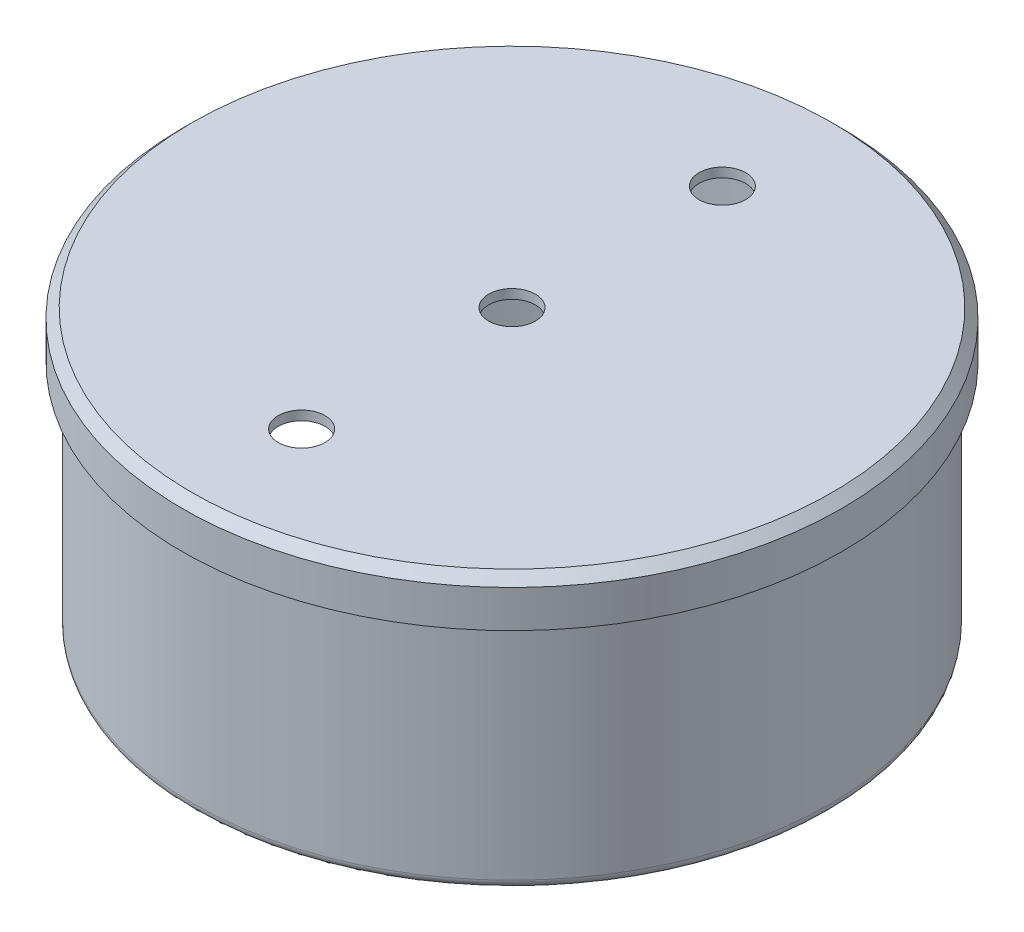
ISO-10303-21;
HEADER;
FILE_DESCRIPTION(('STEP AP214'),'2;1');
FILE_NAME('part.step','',(''),(''),'','','');
FILE_SCHEMA(('AUTOMOTIVE_DESIGN { 1 0 10303 214 1 1 1 1 }'));
ENDSEC;
DATA;
#1=APPLICATION_CONTEXT('core data for automotive mechanical design processes');
#2=APPLICATION_PROTOCOL_DEFINITION('international standard','automotive_design',2000,#1);
#3=PRODUCT_CONTEXT('',#1,'mechanical');
#4=PRODUCT('Part','Part','',(#3));
#5=PRODUCT_RELATED_PRODUCT_CATEGORY('part','',(#4));
#6=PRODUCT_DEFINITION_FORMATION('','',#4);
#7=PRODUCT_DEFINITION_CONTEXT('part definition',#1,'design');
#8=PRODUCT_DEFINITION('design','',#6,#7);
#9=PRODUCT_DEFINITION_SHAPE('','',#8);
#10=(LENGTH_UNIT() NAMED_UNIT(*) SI_UNIT(.MILLI.,.METRE.));
#11=(NAMED_UNIT(*) PLANE_ANGLE_UNIT() SI_UNIT($,.RADIAN.));
#12=(NAMED_UNIT(*) SI_UNIT($,.STERADIAN.) SOLID_ANGLE_UNIT());
#13=UNCERTAINTY_MEASURE_WITH_UNIT(LENGTH_MEASURE(1.E-05),#10,'distance_accuracy_value','');
#14=(GEOMETRIC_REPRESENTATION_CONTEXT(3) GLOBAL_UNCERTAINTY_ASSIGNED_CONTEXT((#13)) GLOBAL_UNIT_ASSIGNED_CONTEXT((#10,
#11,#12)) REPRESENTATION_CONTEXT('',''));
#15=CARTESIAN_POINT('',(0.,0.,0.));
#16=DIRECTION('',(0.,0.,1.));
#17=DIRECTION('',(1.,0.,0.));
#18=AXIS2_PLACEMENT_3D('',#15,#16,#17);
#19=CARTESIAN_POINT('',(0.,-58.,0.));
#20=DIRECTION('',(0.,-1.,0.));
#21=DIRECTION('',(1.,0.,0.));
#22=AXIS2_PLACEMENT_3D('',#19,#20,#21);
#23=TOROIDAL_SURFACE('',#22,66.,1.99999999999999);
#24=CARTESIAN_POINT('',(0.,-58.,0.));
#25=DIRECTION('',(0.,-1.,0.));
#26=DIRECTION('',(1.,0.,0.));
#27=AXIS2_PLACEMENT_3D('',#24,#25,#26);
#28=CIRCLE('',#27,68.);
#29=CARTESIAN_POINT('',(68.,-58.,0.));
#30=VERTEX_POINT('',#29);
#31=EDGE_CURVE('E88',#30,#30,#28,.T.);
#32=ORIENTED_EDGE('',*,*,#31,.T.);
#33=EDGE_LOOP('',(#32));
#34=FACE_BOUND('',#33,.T.);
#35=CARTESIAN_POINT('',(0.,-60.,0.));
#36=DIRECTION('',(0.,-1.,0.));
#37=DIRECTION('',(1.,0.,0.));
#38=AXIS2_PLACEMENT_3D('',#35,#36,#37);
#39=CIRCLE('',#38,66.);
#40=CARTESIAN_POINT('',(66.,-60.,0.));
#41=VERTEX_POINT('',#40);
#42=EDGE_CURVE('E80',#41,#41,#39,.T.);
#43=ORIENTED_EDGE('',*,*,#42,.F.);
#44=EDGE_LOOP('',(#43));
#45=FACE_BOUND('',#44,.T.);
#46=ADVANCED_FACE('F39',(#34,#45),#23,.T.);
#47=CARTESIAN_POINT('',(0.,0.,0.));
#48=DIRECTION('',(0.,1.,0.));
#49=DIRECTION('',(-1.,0.,0.));
#50=AXIS2_PLACEMENT_3D('',#47,#48,#49);
#51=PLANE('',#50);
#52=CARTESIAN_POINT('',(0.,0.,-45.));
#53=DIRECTION('',(0.,1.,0.));
#54=DIRECTION('',(0.,0.,1.));
#55=AXIS2_PLACEMENT_3D('',#52,#53,#54);
#56=CIRCLE('',#55,5.);
#57=CARTESIAN_POINT('',(0.,0.,-40.));
#58=VERTEX_POINT('',#57);
#59=EDGE_CURVE('E63',#58,#58,#56,.T.);
#60=ORIENTED_EDGE('',*,*,#59,.F.);
#61=EDGE_LOOP('',(#60));
#62=FACE_BOUND('',#61,.T.);
#63=CARTESIAN_POINT('',(0.,0.,45.));
#64=DIRECTION('',(0.,1.,0.));
#65=DIRECTION('',(0.,0.,1.));
#66=AXIS2_PLACEMENT_3D('',#63,#64,#65);
#67=CIRCLE('',#66,5.);
#68=CARTESIAN_POINT('',(0.,0.,50.));
#69=VERTEX_POINT('',#68);
#70=EDGE_CURVE('E68',#69,#69,#67,.T.);
#71=ORIENTED_EDGE('',*,*,#70,.F.);
#72=EDGE_LOOP('',(#71));
#73=FACE_BOUND('',#72,.T.);
#74=CARTESIAN_POINT('',(0.,0.,0.));
#75=DIRECTION('',(0.,1.,0.));
#76=DIRECTION('',(0.,0.,1.));
#77=AXIS2_PLACEMENT_3D('',#74,#75,#76);
#78=CIRCLE('',#77,5.);
#79=CARTESIAN_POINT('',(0.,0.,5.));
#80=VERTEX_POINT('',#79);
#81=EDGE_CURVE('E60',#80,#80,#78,.T.);
#82=ORIENTED_EDGE('',*,*,#81,.F.);
#83=EDGE_LOOP('',(#82));
#84=FACE_BOUND('',#83,.T.);
#85=CARTESIAN_POINT('',(0.,0.,0.));
#86=DIRECTION('',(0.,1.,0.));
#87=DIRECTION('',(-1.,0.,0.));
#88=AXIS2_PLACEMENT_3D('',#85,#86,#87);
#89=CIRCLE('',#88,68.4999998132484);
#90=CARTESIAN_POINT('',(-68.4999998132484,0.,0.));
#91=VERTEX_POINT('',#90);
#92=EDGE_CURVE('E10',#91,#91,#89,.T.);
#93=ORIENTED_EDGE('',*,*,#92,.T.);
#94=EDGE_LOOP('',(#93));
#95=FACE_BOUND('',#94,.T.);
#96=ADVANCED_FACE('F101',(#62,#73,#84,#95),#51,.T.);
#97=CARTESIAN_POINT('',(0.,-60.,0.));
#98=DIRECTION('',(0.,-1.,0.));
#99=DIRECTION('',(1.,0.,0.));
#100=AXIS2_PLACEMENT_3D('',#97,#98,#99);
#101=CYLINDRICAL_SURFACE('',#100,70.4999998132484);
#102=CARTESIAN_POINT('',(0.,-2.00000000000004,0.));
#103=DIRECTION('',(0.,1.,0.));
#104=DIRECTION('',(-1.,0.,0.));
#105=AXIS2_PLACEMENT_3D('',#102,#103,#104);
#106=CIRCLE('',#105,70.4999998132484);
#107=CARTESIAN_POINT('',(-70.4999998132484,-2.00000000000006,0.));
#108=VERTEX_POINT('',#107);
#109=EDGE_CURVE('E48',#108,#108,#106,.F.);
#110=ORIENTED_EDGE('',*,*,#109,.T.);
#111=EDGE_LOOP('',(#110));
#112=FACE_BOUND('',#111,.T.);
#113=CARTESIAN_POINT('',(0.,-10.,0.));
#114=DIRECTION('',(0.,-1.,0.));
#115=DIRECTION('',(1.,0.,0.));
#116=AXIS2_PLACEMENT_3D('',#113,#114,#115);
#117=CIRCLE('',#116,70.4999998132484);
#118=CARTESIAN_POINT('',(70.4999998132484,-9.99999999999999,0.));
#119=VERTEX_POINT('',#118);
#120=EDGE_CURVE('E53',#119,#119,#117,.T.);
#121=ORIENTED_EDGE('',*,*,#120,.F.);
#122=EDGE_LOOP('',(#121));
#123=FACE_BOUND('',#122,.T.);
#124=ADVANCED_FACE('F99',(#112,#123),#101,.T.);
#125=CARTESIAN_POINT('',(70.4999998132484,-9.99999999999999,0.));
#126=DIRECTION('',(0.,-1.,0.));
#127=DIRECTION('',(1.,0.,0.));
#128=AXIS2_PLACEMENT_3D('',#125,#126,#127);
#129=PLANE('',#128);
#130=ORIENTED_EDGE('',*,*,#120,.T.);
#131=EDGE_LOOP('',(#130));
#132=FACE_BOUND('',#131,.T.);
#133=CARTESIAN_POINT('',(0.,-10.,0.));
#134=DIRECTION('',(0.,-1.,0.));
#135=DIRECTION('',(1.,0.,0.));
#136=AXIS2_PLACEMENT_3D('',#133,#134,#135);
#137=CIRCLE('',#136,68.);
#138=CARTESIAN_POINT('',(68.,-9.99999999999999,0.));
#139=VERTEX_POINT('',#138);
#140=EDGE_CURVE('E91',#139,#139,#137,.T.);
#141=ORIENTED_EDGE('',*,*,#140,.F.);
#142=EDGE_LOOP('',(#141));
#143=FACE_BOUND('',#142,.T.);
#144=ADVANCED_FACE('F96',(#132,#143),#129,.T.);
#145=CARTESIAN_POINT('',(0.,-60.,0.));
#146=DIRECTION('',(0.,-1.,0.));
#147=DIRECTION('',(1.,0.,0.));
#148=AXIS2_PLACEMENT_3D('',#145,#146,#147);
#149=CYLINDRICAL_SURFACE('',#148,68.);
#150=ORIENTED_EDGE('',*,*,#140,.T.);
#151=EDGE_LOOP('',(#150));
#152=FACE_BOUND('',#151,.T.);
#153=ORIENTED_EDGE('',*,*,#31,.F.);
#154=EDGE_LOOP('',(#153));
#155=FACE_BOUND('',#154,.T.);
#156=ADVANCED_FACE('F108',(#152,#155),#149,.T.);
#157=CARTESIAN_POINT('',(0.,-2.00000000000001,0.));
#158=DIRECTION('',(0.,1.,0.));
#159=DIRECTION('',(-1.,0.,0.));
#160=AXIS2_PLACEMENT_3D('',#157,#158,#159);
#161=PLANE('',#160);
#162=CARTESIAN_POINT('',(0.,-2.00000000000001,-45.));
#163=DIRECTION('',(0.,1.,0.));
#164=DIRECTION('',(-1.,0.,0.));
#165=AXIS2_PLACEMENT_3D('',#162,#163,#164);
#166=CIRCLE('',#165,5.);
#167=CARTESIAN_POINT('',(-5.,-2.00000000000001,-45.));
#168=VERTEX_POINT('',#167);
#169=EDGE_CURVE('E44',#168,#168,#166,.T.);
#170=ORIENTED_EDGE('',*,*,#169,.T.);
#171=EDGE_LOOP('',(#170));
#172=FACE_BOUND('',#171,.T.);
#173=CARTESIAN_POINT('',(0.,-2.00000000000001,45.));
#174=DIRECTION('',(0.,1.,0.));
#175=DIRECTION('',(-1.,0.,0.));
#176=AXIS2_PLACEMENT_3D('',#173,#174,#175);
#177=CIRCLE('',#176,5.);
#178=CARTESIAN_POINT('',(-5.,-2.00000000000001,45.));
#179=VERTEX_POINT('',#178);
#180=EDGE_CURVE('E61',#179,#179,#177,.T.);
#181=ORIENTED_EDGE('',*,*,#180,.T.);
#182=EDGE_LOOP('',(#181));
#183=FACE_BOUND('',#182,.T.);
#184=CARTESIAN_POINT('',(0.,-2.00000000000001,0.));
#185=DIRECTION('',(0.,1.,0.));
#186=DIRECTION('',(-1.,0.,0.));
#187=AXIS2_PLACEMENT_3D('',#184,#185,#186);
#188=CIRCLE('',#187,5.);
#189=CARTESIAN_POINT('',(-5.,-2.00000000000001,0.));
#190=VERTEX_POINT('',#189);
#191=EDGE_CURVE('E57',#190,#190,#188,.T.);
#192=ORIENTED_EDGE('',*,*,#191,.T.);
#193=EDGE_LOOP('',(#192));
#194=FACE_BOUND('',#193,.T.);
#195=CARTESIAN_POINT('',(0.,-2.00000000000001,0.));
#196=DIRECTION('',(0.,1.,0.));
#197=DIRECTION('',(-1.,0.,0.));
#198=AXIS2_PLACEMENT_3D('',#195,#196,#197);
#199=CIRCLE('',#198,68.4999998132484);
#200=CARTESIAN_POINT('',(-68.4999998132484,-2.00000000000004,0.));
#201=VERTEX_POINT('',#200);
#202=EDGE_CURVE('E77',#201,#201,#199,.F.);
#203=ORIENTED_EDGE('',*,*,#202,.T.);
#204=EDGE_LOOP('',(#203));
#205=FACE_BOUND('',#204,.T.);
#206=ADVANCED_FACE('F138',(#172,#183,#194,#205),#161,.F.);
#207=CARTESIAN_POINT('',(0.,-60.,0.));
#208=DIRECTION('',(0.,-1.,0.));
#209=DIRECTION('',(1.,0.,0.));
#210=AXIS2_PLACEMENT_3D('',#207,#208,#209);
#211=CYLINDRICAL_SURFACE('',#210,68.4999998132484);
#212=ORIENTED_EDGE('',*,*,#202,.F.);
#213=EDGE_LOOP('',(#212));
#214=FACE_BOUND('',#213,.T.);
#215=CARTESIAN_POINT('',(0.,-8.00000000000002,0.));
#216=DIRECTION('',(0.,-1.,0.));
#217=DIRECTION('',(1.,0.,0.));
#218=AXIS2_PLACEMENT_3D('',#215,#216,#217);
#219=CIRCLE('',#218,68.4999998132484);
#220=CARTESIAN_POINT('',(68.4999998132484,-7.99999999999999,0.));
#221=VERTEX_POINT('',#220);
#222=EDGE_CURVE('E81',#221,#221,#219,.T.);
#223=ORIENTED_EDGE('',*,*,#222,.T.);
#224=EDGE_LOOP('',(#223));
#225=FACE_BOUND('',#224,.T.);
#226=ADVANCED_FACE('F131',(#214,#225),#211,.F.);
#227=CARTESIAN_POINT('',(70.4999998132484,-7.99999999999999,0.));
#228=DIRECTION('',(0.,-1.,0.));
#229=DIRECTION('',(1.,0.,0.));
#230=AXIS2_PLACEMENT_3D('',#227,#228,#229);
#231=PLANE('',#230);
#232=ORIENTED_EDGE('',*,*,#222,.F.);
#233=EDGE_LOOP('',(#232));
#234=FACE_BOUND('',#233,.T.);
#235=CARTESIAN_POINT('',(0.,-8.00000000000002,0.));
#236=DIRECTION('',(0.,-1.,0.));
#237=DIRECTION('',(1.,0.,0.));
#238=AXIS2_PLACEMENT_3D('',#235,#236,#237);
#239=CIRCLE('',#238,66.);
#240=CARTESIAN_POINT('',(66.,-7.99999999999999,0.));
#241=VERTEX_POINT('',#240);
#242=EDGE_CURVE('E59',#241,#241,#239,.T.);
#243=ORIENTED_EDGE('',*,*,#242,.T.);
#244=EDGE_LOOP('',(#243));
#245=FACE_BOUND('',#244,.T.);
#246=ADVANCED_FACE('F122',(#234,#245),#231,.F.);
#247=CARTESIAN_POINT('',(0.,-60.,0.));
#248=DIRECTION('',(0.,-1.,0.));
#249=DIRECTION('',(1.,0.,0.));
#250=AXIS2_PLACEMENT_3D('',#247,#248,#249);
#251=CYLINDRICAL_SURFACE('',#250,66.);
#252=ORIENTED_EDGE('',*,*,#242,.F.);
#253=EDGE_LOOP('',(#252));
#254=FACE_BOUND('',#253,.T.);
#255=ORIENTED_EDGE('',*,*,#42,.T.);
#256=EDGE_LOOP('',(#255));
#257=FACE_BOUND('',#256,.T.);
#258=ADVANCED_FACE('F120',(#254,#257),#251,.F.);
#259=CARTESIAN_POINT('',(0.,-2.00000000000004,0.));
#260=DIRECTION('',(0.,-1.,0.));
#261=DIRECTION('',(1.,0.,0.));
#262=AXIS2_PLACEMENT_3D('',#259,#260,#261);
#263=CONICAL_SURFACE('',#262,70.4999998132484,0.785398163397448);
#264=ORIENTED_EDGE('',*,*,#92,.F.);
#265=EDGE_LOOP('',(#264));
#266=FACE_BOUND('',#265,.T.);
#267=ORIENTED_EDGE('',*,*,#109,.F.);
#268=EDGE_LOOP('',(#267));
#269=FACE_BOUND('',#268,.T.);
#270=ADVANCED_FACE('F42',(#266,#269),#263,.T.);
#271=CARTESIAN_POINT('',(0.,-10.,0.));
#272=DIRECTION('',(0.,1.,0.));
#273=DIRECTION('',(0.,0.,1.));
#274=AXIS2_PLACEMENT_3D('',#271,#272,#273);
#275=CYLINDRICAL_SURFACE('',#274,5.);
#276=ORIENTED_EDGE('',*,*,#81,.T.);
#277=EDGE_LOOP('',(#276));
#278=FACE_BOUND('',#277,.T.);
#279=ORIENTED_EDGE('',*,*,#191,.F.);
#280=EDGE_LOOP('',(#279));
#281=FACE_BOUND('',#280,.T.);
#282=ADVANCED_FACE('F129',(#278,#281),#275,.F.);
#283=CARTESIAN_POINT('',(0.,-10.,45.));
#284=DIRECTION('',(0.,1.,0.));
#285=DIRECTION('',(0.,0.,1.));
#286=AXIS2_PLACEMENT_3D('',#283,#284,#285);
#287=CYLINDRICAL_SURFACE('',#286,5.);
#288=ORIENTED_EDGE('',*,*,#70,.T.);
#289=EDGE_LOOP('',(#288));
#290=FACE_BOUND('',#289,.T.);
#291=ORIENTED_EDGE('',*,*,#180,.F.);
#292=EDGE_LOOP('',(#291));
#293=FACE_BOUND('',#292,.T.);
#294=ADVANCED_FACE('F154',(#290,#293),#287,.F.);
#295=CARTESIAN_POINT('',(0.,-10.,-45.));
#296=DIRECTION('',(0.,1.,0.));
#297=DIRECTION('',(0.,0.,1.));
#298=AXIS2_PLACEMENT_3D('',#295,#296,#297);
#299=CYLINDRICAL_SURFACE('',#298,5.);
#300=ORIENTED_EDGE('',*,*,#59,.T.);
#301=EDGE_LOOP('',(#300));
#302=FACE_BOUND('',#301,.T.);
#303=ORIENTED_EDGE('',*,*,#169,.F.);
#304=EDGE_LOOP('',(#303));
#305=FACE_BOUND('',#304,.T.);
#306=ADVANCED_FACE('F158',(#302,#305),#299,.F.);
#307=CLOSED_SHELL('',(#46,#96,#124,#144,#156,#206,#226,#246,#258,#270,#282,#294,#306));
#308=MANIFOLD_SOLID_BREP('B2',#307);
#309=ADVANCED_BREP_SHAPE_REPRESENTATION('',(#18,#308),#14);
#310=SHAPE_DEFINITION_REPRESENTATION(#9,#309);
ENDSEC;
END-ISO-10303-21;
